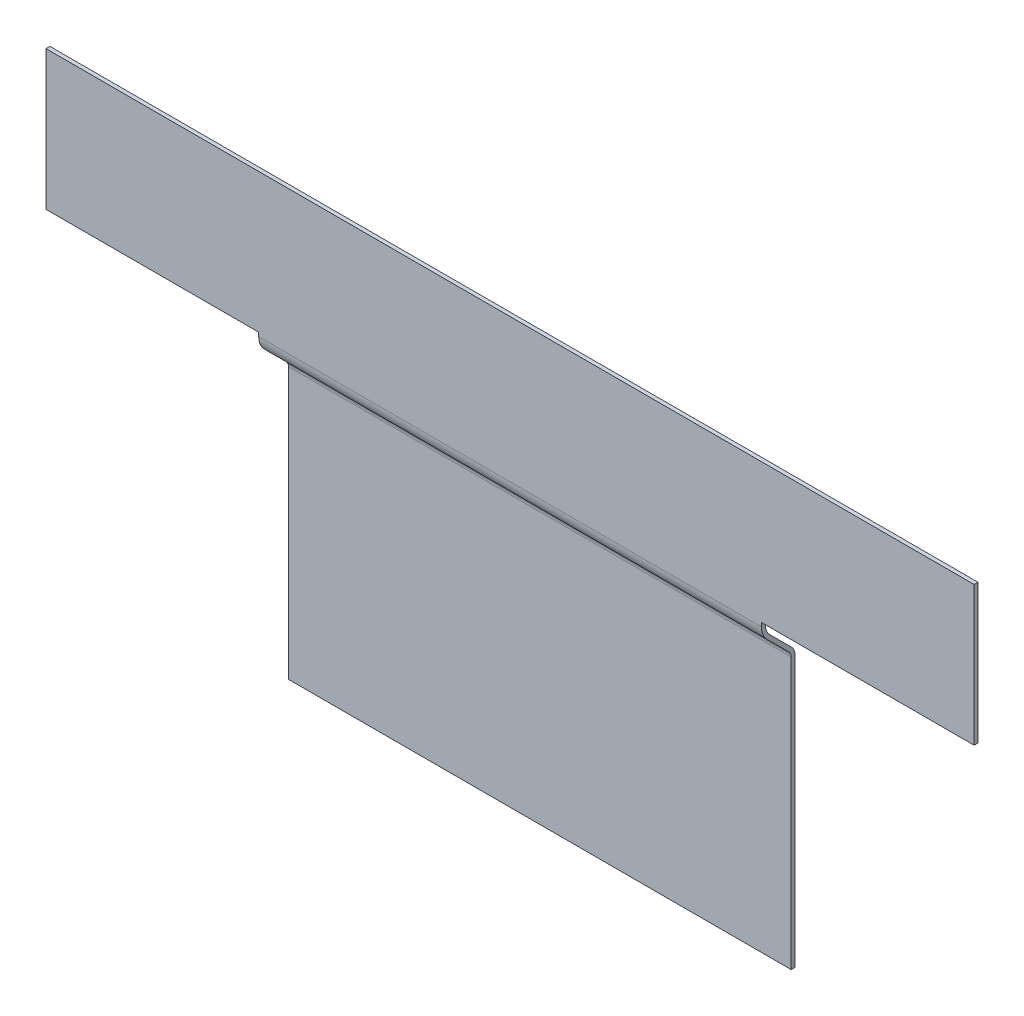
ISO-10303-21;
HEADER;
FILE_DESCRIPTION(('STEP AP214'),'2;1');
FILE_NAME('part.step','',(''),(''),'','','');
FILE_SCHEMA(('AUTOMOTIVE_DESIGN { 1 0 10303 214 1 1 1 1 }'));
ENDSEC;
DATA;
#1=APPLICATION_CONTEXT('core data for automotive mechanical design processes');
#2=APPLICATION_PROTOCOL_DEFINITION('international standard','automotive_design',2000,#1);
#3=PRODUCT_CONTEXT('',#1,'mechanical');
#4=PRODUCT('Part','Part','',(#3));
#5=PRODUCT_RELATED_PRODUCT_CATEGORY('part','',(#4));
#6=PRODUCT_DEFINITION_FORMATION('','',#4);
#7=PRODUCT_DEFINITION_CONTEXT('part definition',#1,'design');
#8=PRODUCT_DEFINITION('design','',#6,#7);
#9=PRODUCT_DEFINITION_SHAPE('','',#8);
#10=(LENGTH_UNIT() NAMED_UNIT(*) SI_UNIT(.MILLI.,.METRE.));
#11=(NAMED_UNIT(*) PLANE_ANGLE_UNIT() SI_UNIT($,.RADIAN.));
#12=(NAMED_UNIT(*) SI_UNIT($,.STERADIAN.) SOLID_ANGLE_UNIT());
#13=UNCERTAINTY_MEASURE_WITH_UNIT(LENGTH_MEASURE(1.E-05),#10,'distance_accuracy_value','');
#14=(GEOMETRIC_REPRESENTATION_CONTEXT(3) GLOBAL_UNCERTAINTY_ASSIGNED_CONTEXT((#13)) GLOBAL_UNIT_ASSIGNED_CONTEXT((#10,
#11,#12)) REPRESENTATION_CONTEXT('',''));
#15=CARTESIAN_POINT('',(0.,0.,0.));
#16=DIRECTION('',(0.,0.,1.));
#17=DIRECTION('',(1.,0.,0.));
#18=AXIS2_PLACEMENT_3D('',#15,#16,#17);
#19=CARTESIAN_POINT('',(-6.,-8.2,0.));
#20=DIRECTION('',(-1.,0.,0.));
#21=DIRECTION('',(0.,0.,1.));
#22=AXIS2_PLACEMENT_3D('',#19,#20,#21);
#23=PLANE('',#22);
#24=DIRECTION('',(0.,0.,1.));
#25=VECTOR('',#24,1.);
#26=CARTESIAN_POINT('',(-6.,-8.2,0.));
#27=LINE('',#26,#25);
#28=CARTESIAN_POINT('',(-6.,-8.2,0.));
#29=VERTEX_POINT('',#28);
#30=CARTESIAN_POINT('',(-6.,-8.2,0.05));
#31=VERTEX_POINT('',#30);
#32=EDGE_CURVE('E11',#29,#31,#27,.T.);
#33=ORIENTED_EDGE('',*,*,#32,.T.);
#34=DIRECTION('',(0.,1.,0.));
#35=VECTOR('',#34,1.);
#36=CARTESIAN_POINT('',(-6.,-8.2,0.05));
#37=LINE('',#36,#35);
#38=CARTESIAN_POINT('',(-6.,-6.4,0.05));
#39=VERTEX_POINT('',#38);
#40=EDGE_CURVE('E230',#31,#39,#37,.T.);
#41=ORIENTED_EDGE('',*,*,#40,.T.);
#42=DIRECTION('',(0.,0.,1.));
#43=VECTOR('',#42,1.);
#44=CARTESIAN_POINT('',(-6.,-6.4,0.));
#45=LINE('',#44,#43);
#46=CARTESIAN_POINT('',(-6.,-6.4,0.));
#47=VERTEX_POINT('',#46);
#48=EDGE_CURVE('E20',#47,#39,#45,.T.);
#49=ORIENTED_EDGE('',*,*,#48,.F.);
#50=DIRECTION('',(0.,1.,0.));
#51=VECTOR('',#50,1.);
#52=CARTESIAN_POINT('',(-6.,-8.2,0.));
#53=LINE('',#52,#51);
#54=EDGE_CURVE('E235',#29,#47,#53,.T.);
#55=ORIENTED_EDGE('',*,*,#54,.F.);
#56=EDGE_LOOP('',(#33,#41,#49,#55));
#57=FACE_BOUND('',#56,.T.);
#58=ADVANCED_FACE('F17',(#57),#23,.T.);
#59=CARTESIAN_POINT('',(-3.25,-8.2,0.));
#60=DIRECTION('',(0.,-1.,0.));
#61=DIRECTION('',(0.,0.,-1.));
#62=AXIS2_PLACEMENT_3D('',#59,#60,#61);
#63=PLANE('',#62);
#64=DIRECTION('',(0.,0.,1.));
#65=VECTOR('',#64,1.);
#66=CARTESIAN_POINT('',(-3.25,-8.2,0.));
#67=LINE('',#66,#65);
#68=CARTESIAN_POINT('',(-3.25,-8.2,0.));
#69=VERTEX_POINT('',#68);
#70=CARTESIAN_POINT('',(-3.25,-8.2,0.05));
#71=VERTEX_POINT('',#70);
#72=EDGE_CURVE('E276',#69,#71,#67,.T.);
#73=ORIENTED_EDGE('',*,*,#72,.T.);
#74=DIRECTION('',(-1.,0.,0.));
#75=VECTOR('',#74,1.);
#76=CARTESIAN_POINT('',(-3.25,-8.2,0.05));
#77=LINE('',#76,#75);
#78=EDGE_CURVE('E234',#71,#31,#77,.T.);
#79=ORIENTED_EDGE('',*,*,#78,.T.);
#80=ORIENTED_EDGE('',*,*,#32,.F.);
#81=DIRECTION('',(-1.,0.,0.));
#82=VECTOR('',#81,1.);
#83=CARTESIAN_POINT('',(-3.25,-8.2,0.));
#84=LINE('',#83,#82);
#85=EDGE_CURVE('E262',#69,#29,#84,.T.);
#86=ORIENTED_EDGE('',*,*,#85,.F.);
#87=EDGE_LOOP('',(#73,#79,#80,#86));
#88=FACE_BOUND('',#87,.T.);
#89=ADVANCED_FACE('F402',(#88),#63,.T.);
#90=CARTESIAN_POINT('',(6.,-6.4,0.));
#91=DIRECTION('',(1.,0.,0.));
#92=DIRECTION('',(0.,1.,0.));
#93=AXIS2_PLACEMENT_3D('',#90,#91,#92);
#94=PLANE('',#93);
#95=DIRECTION('',(0.,0.,1.));
#96=VECTOR('',#95,1.);
#97=CARTESIAN_POINT('',(6.,-6.4,0.));
#98=LINE('',#97,#96);
#99=CARTESIAN_POINT('',(6.,-6.4,0.));
#100=VERTEX_POINT('',#99);
#101=CARTESIAN_POINT('',(6.,-6.4,0.05));
#102=VERTEX_POINT('',#101);
#103=EDGE_CURVE('E26',#100,#102,#98,.T.);
#104=ORIENTED_EDGE('',*,*,#103,.T.);
#105=DIRECTION('',(0.,-1.,0.));
#106=VECTOR('',#105,1.);
#107=CARTESIAN_POINT('',(6.,-6.4,0.05));
#108=LINE('',#107,#106);
#109=CARTESIAN_POINT('',(6.,-8.2,0.05));
#110=VERTEX_POINT('',#109);
#111=EDGE_CURVE('E214',#102,#110,#108,.T.);
#112=ORIENTED_EDGE('',*,*,#111,.T.);
#113=DIRECTION('',(0.,0.,1.));
#114=VECTOR('',#113,1.);
#115=CARTESIAN_POINT('',(6.,-8.2,0.));
#116=LINE('',#115,#114);
#117=CARTESIAN_POINT('',(6.,-8.2,0.));
#118=VERTEX_POINT('',#117);
#119=EDGE_CURVE('E48',#118,#110,#116,.T.);
#120=ORIENTED_EDGE('',*,*,#119,.F.);
#121=DIRECTION('',(0.,-1.,0.));
#122=VECTOR('',#121,1.);
#123=CARTESIAN_POINT('',(6.,-6.4,0.));
#124=LINE('',#123,#122);
#125=EDGE_CURVE('E219',#100,#118,#124,.T.);
#126=ORIENTED_EDGE('',*,*,#125,.F.);
#127=EDGE_LOOP('',(#104,#112,#120,#126));
#128=FACE_BOUND('',#127,.T.);
#129=ADVANCED_FACE('F408',(#128),#94,.T.);
#130=CARTESIAN_POINT('',(-6.,-6.4,0.));
#131=DIRECTION('',(0.,1.,0.));
#132=DIRECTION('',(1.,0.,0.));
#133=AXIS2_PLACEMENT_3D('',#130,#131,#132);
#134=PLANE('',#133);
#135=ORIENTED_EDGE('',*,*,#48,.T.);
#136=DIRECTION('',(1.,0.,0.));
#137=VECTOR('',#136,1.);
#138=CARTESIAN_POINT('',(-6.,-6.4,0.05));
#139=LINE('',#138,#137);
#140=EDGE_CURVE('E217',#39,#102,#139,.T.);
#141=ORIENTED_EDGE('',*,*,#140,.T.);
#142=ORIENTED_EDGE('',*,*,#103,.F.);
#143=DIRECTION('',(1.,0.,0.));
#144=VECTOR('',#143,1.);
#145=CARTESIAN_POINT('',(-6.,-6.4,0.));
#146=LINE('',#145,#144);
#147=EDGE_CURVE('E224',#47,#100,#146,.T.);
#148=ORIENTED_EDGE('',*,*,#147,.F.);
#149=EDGE_LOOP('',(#135,#141,#142,#148));
#150=FACE_BOUND('',#149,.T.);
#151=ADVANCED_FACE('F407',(#150),#134,.T.);
#152=CARTESIAN_POINT('',(6.,-8.2,0.));
#153=DIRECTION('',(0.,-1.,0.));
#154=DIRECTION('',(0.,0.,-1.));
#155=AXIS2_PLACEMENT_3D('',#152,#153,#154);
#156=PLANE('',#155);
#157=ORIENTED_EDGE('',*,*,#119,.T.);
#158=DIRECTION('',(-1.,0.,0.));
#159=VECTOR('',#158,1.);
#160=CARTESIAN_POINT('',(6.,-8.2,0.05));
#161=LINE('',#160,#159);
#162=CARTESIAN_POINT('',(3.25,-8.2,0.05));
#163=VERTEX_POINT('',#162);
#164=EDGE_CURVE('E218',#110,#163,#161,.T.);
#165=ORIENTED_EDGE('',*,*,#164,.T.);
#166=DIRECTION('',(0.,0.,1.));
#167=VECTOR('',#166,1.);
#168=CARTESIAN_POINT('',(3.25,-8.2,0.));
#169=LINE('',#168,#167);
#170=CARTESIAN_POINT('',(3.25,-8.2,0.));
#171=VERTEX_POINT('',#170);
#172=EDGE_CURVE('E245',#171,#163,#169,.T.);
#173=ORIENTED_EDGE('',*,*,#172,.F.);
#174=DIRECTION('',(-1.,0.,0.));
#175=VECTOR('',#174,1.);
#176=CARTESIAN_POINT('',(6.,-8.2,0.));
#177=LINE('',#176,#175);
#178=EDGE_CURVE('E223',#118,#171,#177,.T.);
#179=ORIENTED_EDGE('',*,*,#178,.F.);
#180=EDGE_LOOP('',(#157,#165,#173,#179));
#181=FACE_BOUND('',#180,.T.);
#182=ADVANCED_FACE('F384',(#181),#156,.T.);
#183=CARTESIAN_POINT('',(0.,-7.315072202166,0.05));
#184=DIRECTION('',(0.,0.,1.));
#185=DIRECTION('',(1.,0.,0.));
#186=AXIS2_PLACEMENT_3D('',#183,#184,#185);
#187=PLANE('',#186);
#188=ORIENTED_EDGE('',*,*,#40,.F.);
#189=ORIENTED_EDGE('',*,*,#78,.F.);
#190=DIRECTION('',(0.,1.,0.));
#191=VECTOR('',#190,1.);
#192=CARTESIAN_POINT('',(-3.25,-8.25,0.05));
#193=LINE('',#192,#191);
#194=CARTESIAN_POINT('',(-3.25,-8.25,0.05));
#195=VERTEX_POINT('',#194);
#196=EDGE_CURVE('E269',#195,#71,#193,.T.);
#197=ORIENTED_EDGE('',*,*,#196,.F.);
#198=DIRECTION('',(-1.,0.,0.));
#199=VECTOR('',#198,1.);
#200=CARTESIAN_POINT('',(3.25,-8.25,0.05));
#201=LINE('',#200,#199);
#202=CARTESIAN_POINT('',(3.25,-8.25,0.05));
#203=VERTEX_POINT('',#202);
#204=EDGE_CURVE('E238',#203,#195,#201,.T.);
#205=ORIENTED_EDGE('',*,*,#204,.F.);
#206=DIRECTION('',(0.,-1.,0.));
#207=VECTOR('',#206,1.);
#208=CARTESIAN_POINT('',(3.25,-8.2,0.05));
#209=LINE('',#208,#207);
#210=EDGE_CURVE('E249',#163,#203,#209,.T.);
#211=ORIENTED_EDGE('',*,*,#210,.F.);
#212=ORIENTED_EDGE('',*,*,#164,.F.);
#213=ORIENTED_EDGE('',*,*,#111,.F.);
#214=ORIENTED_EDGE('',*,*,#140,.F.);
#215=EDGE_LOOP('',(#188,#189,#197,#205,#211,#212,#213,#214));
#216=FACE_BOUND('',#215,.T.);
#217=ADVANCED_FACE('F391',(#216),#187,.T.);
#218=CARTESIAN_POINT('',(0.,-7.315072202166,0.));
#219=DIRECTION('',(0.,0.,1.));
#220=DIRECTION('',(1.,0.,0.));
#221=AXIS2_PLACEMENT_3D('',#218,#219,#220);
#222=PLANE('',#221);
#223=ORIENTED_EDGE('',*,*,#147,.T.);
#224=ORIENTED_EDGE('',*,*,#125,.T.);
#225=ORIENTED_EDGE('',*,*,#178,.T.);
#226=DIRECTION('',(0.,-1.,0.));
#227=VECTOR('',#226,1.);
#228=CARTESIAN_POINT('',(3.25,-8.2,0.));
#229=LINE('',#228,#227);
#230=CARTESIAN_POINT('',(3.25,-8.25,0.));
#231=VERTEX_POINT('',#230);
#232=EDGE_CURVE('E253',#171,#231,#229,.T.);
#233=ORIENTED_EDGE('',*,*,#232,.T.);
#234=DIRECTION('',(-1.,0.,0.));
#235=VECTOR('',#234,1.);
#236=CARTESIAN_POINT('',(3.25,-8.25,0.));
#237=LINE('',#236,#235);
#238=CARTESIAN_POINT('',(-3.25,-8.25,0.));
#239=VERTEX_POINT('',#238);
#240=EDGE_CURVE('E175',#231,#239,#237,.T.);
#241=ORIENTED_EDGE('',*,*,#240,.T.);
#242=DIRECTION('',(0.,1.,0.));
#243=VECTOR('',#242,1.);
#244=CARTESIAN_POINT('',(-3.25,-8.25,0.));
#245=LINE('',#244,#243);
#246=EDGE_CURVE('E258',#239,#69,#245,.T.);
#247=ORIENTED_EDGE('',*,*,#246,.T.);
#248=ORIENTED_EDGE('',*,*,#85,.T.);
#249=ORIENTED_EDGE('',*,*,#54,.T.);
#250=EDGE_LOOP('',(#223,#224,#225,#233,#241,#247,#248,#249));
#251=FACE_BOUND('',#250,.T.);
#252=ADVANCED_FACE('F382',(#251),#222,.F.);
#253=CARTESIAN_POINT('',(3.25,-8.25,-0.2));
#254=DIRECTION('',(-1.,0.,0.));
#255=DIRECTION('',(0.,0.,1.));
#256=AXIS2_PLACEMENT_3D('',#253,#254,#255);
#257=CYLINDRICAL_SURFACE('',#256,0.25);
#258=ORIENTED_EDGE('',*,*,#204,.T.);
#259=CARTESIAN_POINT('',(-3.25,-8.25,-0.2));
#260=DIRECTION('',(1.,0.,0.));
#261=DIRECTION('',(0.,0.,1.));
#262=AXIS2_PLACEMENT_3D('',#259,#260,#261);
#263=CIRCLE('',#262,0.25);
#264=CARTESIAN_POINT('',(-3.25,-8.426776695297,-0.02322330470336));
#265=VERTEX_POINT('',#264);
#266=EDGE_CURVE('E242',#195,#265,#263,.T.);
#267=ORIENTED_EDGE('',*,*,#266,.T.);
#268=DIRECTION('',(-1.,0.,0.));
#269=VECTOR('',#268,1.);
#270=CARTESIAN_POINT('',(3.25,-8.426776695297,-0.02322330470336));
#271=LINE('',#270,#269);
#272=CARTESIAN_POINT('',(3.25,-8.426776695297,-0.02322330470336));
#273=VERTEX_POINT('',#272);
#274=EDGE_CURVE('E213',#273,#265,#271,.T.);
#275=ORIENTED_EDGE('',*,*,#274,.F.);
#276=CARTESIAN_POINT('',(3.25,-8.25,-0.2));
#277=DIRECTION('',(1.,0.,0.));
#278=DIRECTION('',(0.,0.,1.));
#279=AXIS2_PLACEMENT_3D('',#276,#277,#278);
#280=CIRCLE('',#279,0.25);
#281=EDGE_CURVE('E180',#203,#273,#280,.T.);
#282=ORIENTED_EDGE('',*,*,#281,.F.);
#283=EDGE_LOOP('',(#258,#267,#275,#282));
#284=FACE_BOUND('',#283,.T.);
#285=ADVANCED_FACE('F396',(#284),#257,.T.);
#286=CARTESIAN_POINT('',(-3.25,-8.25,-0.2));
#287=DIRECTION('',(1.,0.,0.));
#288=DIRECTION('',(0.,0.,1.));
#289=AXIS2_PLACEMENT_3D('',#286,#287,#288);
#290=CYLINDRICAL_SURFACE('',#289,0.2);
#291=ORIENTED_EDGE('',*,*,#240,.F.);
#292=CARTESIAN_POINT('',(3.25,-8.25,-0.2));
#293=DIRECTION('',(1.,0.,0.));
#294=DIRECTION('',(0.,0.,1.));
#295=AXIS2_PLACEMENT_3D('',#292,#293,#294);
#296=CIRCLE('',#295,0.2);
#297=CARTESIAN_POINT('',(3.25,-8.391421356237,-0.05857864376269));
#298=VERTEX_POINT('',#297);
#299=EDGE_CURVE('E169',#231,#298,#296,.T.);
#300=ORIENTED_EDGE('',*,*,#299,.T.);
#301=DIRECTION('',(1.,0.,0.));
#302=VECTOR('',#301,1.);
#303=CARTESIAN_POINT('',(-3.25,-8.391421356237,-0.05857864376269));
#304=LINE('',#303,#302);
#305=CARTESIAN_POINT('',(-3.25,-8.391421356237,-0.05857864376269));
#306=VERTEX_POINT('',#305);
#307=EDGE_CURVE('E173',#306,#298,#304,.T.);
#308=ORIENTED_EDGE('',*,*,#307,.F.);
#309=CARTESIAN_POINT('',(-3.25,-8.25,-0.2));
#310=DIRECTION('',(1.,0.,0.));
#311=DIRECTION('',(0.,0.,1.));
#312=AXIS2_PLACEMENT_3D('',#309,#310,#311);
#313=CIRCLE('',#312,0.2);
#314=EDGE_CURVE('E229',#239,#306,#313,.T.);
#315=ORIENTED_EDGE('',*,*,#314,.F.);
#316=EDGE_LOOP('',(#291,#300,#308,#315));
#317=FACE_BOUND('',#316,.T.);
#318=ADVANCED_FACE('F171',(#317),#290,.F.);
#319=CARTESIAN_POINT('',(0.,-8.568198051534,-0.164644660941));
#320=DIRECTION('',(0.,0.707106781186548,-0.707106781186548));
#321=DIRECTION('',(-1.,0.,0.));
#322=AXIS2_PLACEMENT_3D('',#319,#320,#321);
#323=PLANE('',#322);
#324=DIRECTION('',(0.,0.707106781186548,0.707106781186548));
#325=VECTOR('',#324,1.);
#326=CARTESIAN_POINT('',(-3.25,-8.709619407771,-0.306066017178));
#327=LINE('',#326,#325);
#328=CARTESIAN_POINT('',(-3.25,-8.709619407771,-0.306066017178));
#329=VERTEX_POINT('',#328);
#330=EDGE_CURVE('E209',#329,#265,#327,.T.);
#331=ORIENTED_EDGE('',*,*,#330,.F.);
#332=DIRECTION('',(-1.,0.,0.));
#333=VECTOR('',#332,1.);
#334=CARTESIAN_POINT('',(3.25,-8.709619407771,-0.306066017178));
#335=LINE('',#334,#333);
#336=CARTESIAN_POINT('',(3.25,-8.709619407771,-0.306066017178));
#337=VERTEX_POINT('',#336);
#338=EDGE_CURVE('E309',#337,#329,#335,.T.);
#339=ORIENTED_EDGE('',*,*,#338,.F.);
#340=DIRECTION('',(0.,-0.707106781186548,-0.707106781186548));
#341=VECTOR('',#340,1.);
#342=CARTESIAN_POINT('',(3.25,-8.426776695297,-0.02322330470336));
#343=LINE('',#342,#341);
#344=EDGE_CURVE('E197',#273,#337,#343,.T.);
#345=ORIENTED_EDGE('',*,*,#344,.F.);
#346=ORIENTED_EDGE('',*,*,#274,.T.);
#347=EDGE_LOOP('',(#331,#339,#345,#346));
#348=FACE_BOUND('',#347,.T.);
#349=ADVANCED_FACE('F399',(#348),#323,.F.);
#350=CARTESIAN_POINT('',(0.,-8.532842712475,-0.2));
#351=DIRECTION('',(0.,0.707106781186548,-0.707106781186548));
#352=DIRECTION('',(-1.,0.,0.));
#353=AXIS2_PLACEMENT_3D('',#350,#351,#352);
#354=PLANE('',#353);
#355=ORIENTED_EDGE('',*,*,#307,.T.);
#356=DIRECTION('',(0.,-0.707106781186548,-0.707106781186548));
#357=VECTOR('',#356,1.);
#358=CARTESIAN_POINT('',(3.25,-8.391421356237,-0.05857864376269));
#359=LINE('',#358,#357);
#360=CARTESIAN_POINT('',(3.25,-8.674264068712,-0.341421356237));
#361=VERTEX_POINT('',#360);
#362=EDGE_CURVE('E186',#298,#361,#359,.T.);
#363=ORIENTED_EDGE('',*,*,#362,.T.);
#364=DIRECTION('',(-1.,0.,0.));
#365=VECTOR('',#364,1.);
#366=CARTESIAN_POINT('',(3.25,-8.674264068712,-0.341421356237));
#367=LINE('',#366,#365);
#368=CARTESIAN_POINT('',(-3.25,-8.674264068712,-0.341421356237));
#369=VERTEX_POINT('',#368);
#370=EDGE_CURVE('E310',#361,#369,#367,.T.);
#371=ORIENTED_EDGE('',*,*,#370,.T.);
#372=DIRECTION('',(0.,0.707106781186548,0.707106781186548));
#373=VECTOR('',#372,1.);
#374=CARTESIAN_POINT('',(-3.25,-8.674264068712,-0.341421356237));
#375=LINE('',#374,#373);
#376=EDGE_CURVE('E188',#369,#306,#375,.T.);
#377=ORIENTED_EDGE('',*,*,#376,.T.);
#378=EDGE_LOOP('',(#355,#363,#371,#377));
#379=FACE_BOUND('',#378,.T.);
#380=ADVANCED_FACE('F184',(#379),#354,.T.);
#381=CARTESIAN_POINT('',(-3.25,-12.28033008589,-0.385355339059));
#382=DIRECTION('',(-1.,0.,0.));
#383=DIRECTION('',(0.,0.,1.));
#384=AXIS2_PLACEMENT_3D('',#381,#382,#383);
#385=PLANE('',#384);
#386=DIRECTION('',(0.,0.,1.));
#387=VECTOR('',#386,1.);
#388=CARTESIAN_POINT('',(-3.25,-12.28033008589,-0.385355339059));
#389=LINE('',#388,#387);
#390=CARTESIAN_POINT('',(-3.25,-12.28033008589,-0.385355339059));
#391=VERTEX_POINT('',#390);
#392=CARTESIAN_POINT('',(-3.25,-12.28033008589,-0.335355339059));
#393=VERTEX_POINT('',#392);
#394=EDGE_CURVE('E291',#391,#393,#389,.T.);
#395=ORIENTED_EDGE('',*,*,#394,.T.);
#396=DIRECTION('',(0.,1.,0.));
#397=VECTOR('',#396,1.);
#398=CARTESIAN_POINT('',(-3.25,-12.28033008589,-0.335355339059));
#399=LINE('',#398,#397);
#400=CARTESIAN_POINT('',(-3.25,-8.78033008589,-0.335355339059));
#401=VERTEX_POINT('',#400);
#402=EDGE_CURVE('E334',#393,#401,#399,.T.);
#403=ORIENTED_EDGE('',*,*,#402,.T.);
#404=CARTESIAN_POINT('',(-3.25,-8.78033008589,-0.235355339059));
#405=DIRECTION('',(-1.,0.,0.));
#406=DIRECTION('',(0.,0.707106781186548,-0.707106781186548));
#407=AXIS2_PLACEMENT_3D('',#404,#405,#406);
#408=CIRCLE('',#407,0.1);
#409=EDGE_CURVE('E203',#329,#401,#408,.T.);
#410=ORIENTED_EDGE('',*,*,#409,.F.);
#411=ORIENTED_EDGE('',*,*,#330,.T.);
#412=ORIENTED_EDGE('',*,*,#266,.F.);
#413=ORIENTED_EDGE('',*,*,#196,.T.);
#414=ORIENTED_EDGE('',*,*,#72,.F.);
#415=ORIENTED_EDGE('',*,*,#246,.F.);
#416=ORIENTED_EDGE('',*,*,#314,.T.);
#417=ORIENTED_EDGE('',*,*,#376,.F.);
#418=CARTESIAN_POINT('',(-3.25,-8.78033008589,-0.235355339059));
#419=DIRECTION('',(-1.,0.,0.));
#420=DIRECTION('',(0.,0.707106781186548,-0.707106781186548));
#421=AXIS2_PLACEMENT_3D('',#418,#419,#420);
#422=CIRCLE('',#421,0.15);
#423=CARTESIAN_POINT('',(-3.25,-8.78033008589,-0.385355339059));
#424=VERTEX_POINT('',#423);
#425=EDGE_CURVE('E306',#369,#424,#422,.T.);
#426=ORIENTED_EDGE('',*,*,#425,.T.);
#427=DIRECTION('',(0.,1.,0.));
#428=VECTOR('',#427,1.);
#429=CARTESIAN_POINT('',(-3.25,-12.28033008589,-0.385355339059));
#430=LINE('',#429,#428);
#431=EDGE_CURVE('E305',#391,#424,#430,.T.);
#432=ORIENTED_EDGE('',*,*,#431,.F.);
#433=EDGE_LOOP('',(#395,#403,#410,#411,#412,#413,#414,#415,#416,#417,#426,#432));
#434=FACE_BOUND('',#433,.T.);
#435=ADVANCED_FACE('F356',(#434),#385,.T.);
#436=CARTESIAN_POINT('',(3.25,-8.78033008589,-0.235355339059));
#437=DIRECTION('',(-1.,0.,0.));
#438=DIRECTION('',(0.,0.707106781186548,-0.707106781186548));
#439=AXIS2_PLACEMENT_3D('',#436,#437,#438);
#440=CYLINDRICAL_SURFACE('',#439,0.1);
#441=ORIENTED_EDGE('',*,*,#338,.T.);
#442=ORIENTED_EDGE('',*,*,#409,.T.);
#443=DIRECTION('',(-1.,0.,0.));
#444=VECTOR('',#443,1.);
#445=CARTESIAN_POINT('',(3.25,-8.78033008589,-0.335355339059));
#446=LINE('',#445,#444);
#447=CARTESIAN_POINT('',(3.25,-8.78033008589,-0.335355339059));
#448=VERTEX_POINT('',#447);
#449=EDGE_CURVE('E325',#448,#401,#446,.T.);
#450=ORIENTED_EDGE('',*,*,#449,.F.);
#451=CARTESIAN_POINT('',(3.25,-8.78033008589,-0.235355339059));
#452=DIRECTION('',(-1.,0.,0.));
#453=DIRECTION('',(0.,0.707106781186548,-0.707106781186548));
#454=AXIS2_PLACEMENT_3D('',#451,#452,#453);
#455=CIRCLE('',#454,0.1);
#456=EDGE_CURVE('E301',#337,#448,#455,.T.);
#457=ORIENTED_EDGE('',*,*,#456,.F.);
#458=EDGE_LOOP('',(#441,#442,#450,#457));
#459=FACE_BOUND('',#458,.T.);
#460=ADVANCED_FACE('F346',(#459),#440,.F.);
#461=CARTESIAN_POINT('',(-3.25,-8.78033008589,-0.235355339059));
#462=DIRECTION('',(1.,0.,0.));
#463=DIRECTION('',(0.,0.707106781186548,-0.707106781186548));
#464=AXIS2_PLACEMENT_3D('',#461,#462,#463);
#465=CYLINDRICAL_SURFACE('',#464,0.15);
#466=ORIENTED_EDGE('',*,*,#370,.F.);
#467=CARTESIAN_POINT('',(3.25,-8.78033008589,-0.235355339059));
#468=DIRECTION('',(-1.,0.,0.));
#469=DIRECTION('',(0.,0.707106781186548,-0.707106781186548));
#470=AXIS2_PLACEMENT_3D('',#467,#468,#469);
#471=CIRCLE('',#470,0.15);
#472=CARTESIAN_POINT('',(3.25,-8.78033008589,-0.385355339059));
#473=VERTEX_POINT('',#472);
#474=EDGE_CURVE('E195',#361,#473,#471,.T.);
#475=ORIENTED_EDGE('',*,*,#474,.T.);
#476=DIRECTION('',(1.,0.,0.));
#477=VECTOR('',#476,1.);
#478=CARTESIAN_POINT('',(-3.25,-8.78033008589,-0.385355339059));
#479=LINE('',#478,#477);
#480=EDGE_CURVE('E302',#424,#473,#479,.T.);
#481=ORIENTED_EDGE('',*,*,#480,.F.);
#482=ORIENTED_EDGE('',*,*,#425,.F.);
#483=EDGE_LOOP('',(#466,#475,#481,#482));
#484=FACE_BOUND('',#483,.T.);
#485=ADVANCED_FACE('F380',(#484),#465,.T.);
#486=CARTESIAN_POINT('',(0.,-10.53033008589,-0.335355339059));
#487=DIRECTION('',(0.,0.,-1.));
#488=DIRECTION('',(-1.,0.,0.));
#489=AXIS2_PLACEMENT_3D('',#486,#487,#488);
#490=PLANE('',#489);
#491=ORIENTED_EDGE('',*,*,#402,.F.);
#492=DIRECTION('',(-1.,0.,0.));
#493=VECTOR('',#492,1.);
#494=CARTESIAN_POINT('',(3.25,-12.28033008589,-0.335355339059));
#495=LINE('',#494,#493);
#496=CARTESIAN_POINT('',(3.25,-12.28033008589,-0.335355339059));
#497=VERTEX_POINT('',#496);
#498=EDGE_CURVE('E296',#497,#393,#495,.T.);
#499=ORIENTED_EDGE('',*,*,#498,.F.);
#500=DIRECTION('',(0.,-1.,0.));
#501=VECTOR('',#500,1.);
#502=CARTESIAN_POINT('',(3.25,-8.78033008589,-0.335355339059));
#503=LINE('',#502,#501);
#504=EDGE_CURVE('E355',#448,#497,#503,.T.);
#505=ORIENTED_EDGE('',*,*,#504,.F.);
#506=ORIENTED_EDGE('',*,*,#449,.T.);
#507=EDGE_LOOP('',(#491,#499,#505,#506));
#508=FACE_BOUND('',#507,.T.);
#509=ADVANCED_FACE('F353',(#508),#490,.F.);
#510=CARTESIAN_POINT('',(0.,-10.53033008589,-0.385355339059));
#511=DIRECTION('',(0.,0.,-1.));
#512=DIRECTION('',(-1.,0.,0.));
#513=AXIS2_PLACEMENT_3D('',#510,#511,#512);
#514=PLANE('',#513);
#515=ORIENTED_EDGE('',*,*,#480,.T.);
#516=DIRECTION('',(0.,-1.,0.));
#517=VECTOR('',#516,1.);
#518=CARTESIAN_POINT('',(3.25,-8.78033008589,-0.385355339059));
#519=LINE('',#518,#517);
#520=CARTESIAN_POINT('',(3.25,-12.28033008589,-0.385355339059));
#521=VERTEX_POINT('',#520);
#522=EDGE_CURVE('E297',#473,#521,#519,.T.);
#523=ORIENTED_EDGE('',*,*,#522,.T.);
#524=DIRECTION('',(-1.,0.,0.));
#525=VECTOR('',#524,1.);
#526=CARTESIAN_POINT('',(3.25,-12.28033008589,-0.385355339059));
#527=LINE('',#526,#525);
#528=EDGE_CURVE('E295',#521,#391,#527,.T.);
#529=ORIENTED_EDGE('',*,*,#528,.T.);
#530=ORIENTED_EDGE('',*,*,#431,.T.);
#531=EDGE_LOOP('',(#515,#523,#529,#530));
#532=FACE_BOUND('',#531,.T.);
#533=ADVANCED_FACE('F376',(#532),#514,.T.);
#534=CARTESIAN_POINT('',(3.25,-12.28033008589,-0.385355339059));
#535=DIRECTION('',(0.,-1.,0.));
#536=DIRECTION('',(0.,0.,-1.));
#537=AXIS2_PLACEMENT_3D('',#534,#535,#536);
#538=PLANE('',#537);
#539=DIRECTION('',(0.,0.,1.));
#540=VECTOR('',#539,1.);
#541=CARTESIAN_POINT('',(3.25,-12.28033008589,-0.385355339059));
#542=LINE('',#541,#540);
#543=EDGE_CURVE('E289',#521,#497,#542,.T.);
#544=ORIENTED_EDGE('',*,*,#543,.T.);
#545=ORIENTED_EDGE('',*,*,#498,.T.);
#546=ORIENTED_EDGE('',*,*,#394,.F.);
#547=ORIENTED_EDGE('',*,*,#528,.F.);
#548=EDGE_LOOP('',(#544,#545,#546,#547));
#549=FACE_BOUND('',#548,.T.);
#550=ADVANCED_FACE('F374',(#549),#538,.T.);
#551=CARTESIAN_POINT('',(3.25,-8.78033008589,-0.385355339059));
#552=DIRECTION('',(1.,0.,0.));
#553=DIRECTION('',(0.,0.,1.));
#554=AXIS2_PLACEMENT_3D('',#551,#552,#553);
#555=PLANE('',#554);
#556=ORIENTED_EDGE('',*,*,#522,.F.);
#557=ORIENTED_EDGE('',*,*,#474,.F.);
#558=ORIENTED_EDGE('',*,*,#362,.F.);
#559=ORIENTED_EDGE('',*,*,#299,.F.);
#560=ORIENTED_EDGE('',*,*,#232,.F.);
#561=ORIENTED_EDGE('',*,*,#172,.T.);
#562=ORIENTED_EDGE('',*,*,#210,.T.);
#563=ORIENTED_EDGE('',*,*,#281,.T.);
#564=ORIENTED_EDGE('',*,*,#344,.T.);
#565=ORIENTED_EDGE('',*,*,#456,.T.);
#566=ORIENTED_EDGE('',*,*,#504,.T.);
#567=ORIENTED_EDGE('',*,*,#543,.F.);
#568=EDGE_LOOP('',(#556,#557,#558,#559,#560,#561,#562,#563,#564,#565,#566,#567));
#569=FACE_BOUND('',#568,.T.);
#570=ADVANCED_FACE('F193',(#569),#555,.T.);
#571=CLOSED_SHELL('',(#58,#89,#129,#151,#182,#217,#252,#285,#318,#349,#380,#435,#460,#485,#509,
#533,#550,#570));
#572=MANIFOLD_SOLID_BREP('B1',#571);
#573=ADVANCED_BREP_SHAPE_REPRESENTATION('',(#18,#572),#14);
#574=SHAPE_DEFINITION_REPRESENTATION(#9,#573);
ENDSEC;
END-ISO-10303-21;
